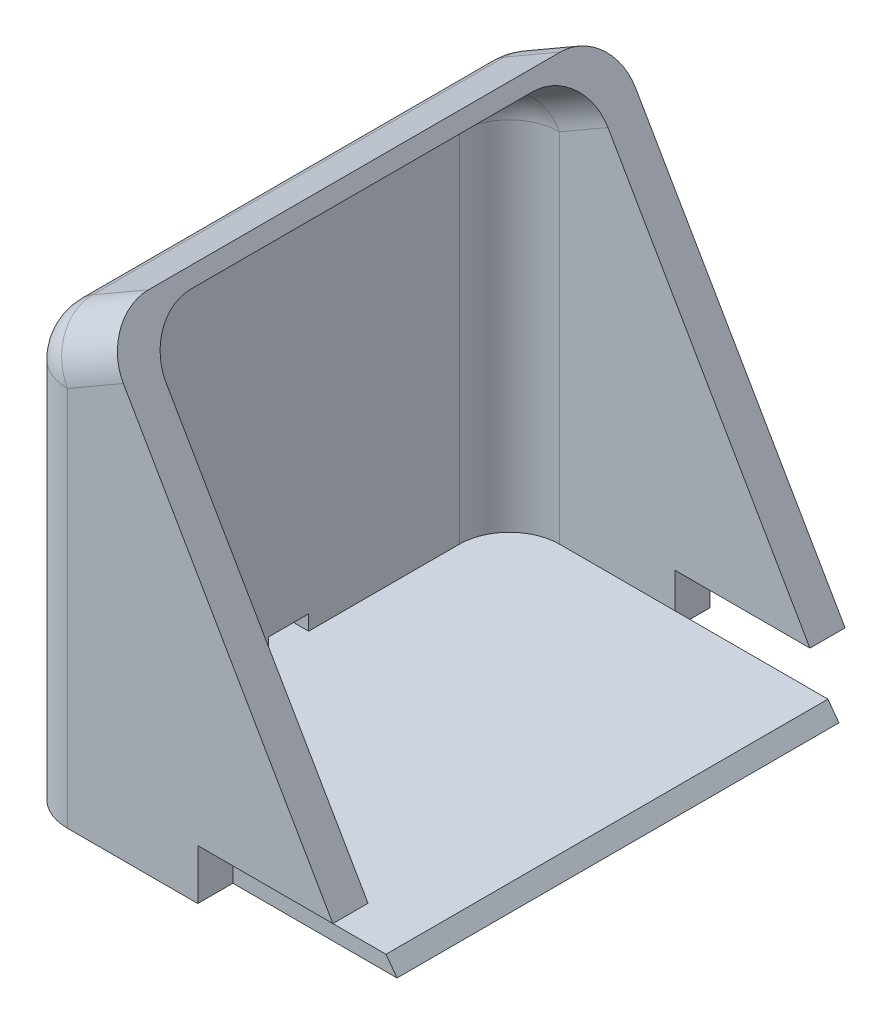
ISO-10303-21;
HEADER;
FILE_DESCRIPTION(('STEP AP214'),'2;1');
FILE_NAME('part.step','',(''),(''),'','','');
FILE_SCHEMA(('AUTOMOTIVE_DESIGN { 1 0 10303 214 1 1 1 1 }'));
ENDSEC;
DATA;
#1=APPLICATION_CONTEXT('core data for automotive mechanical design processes');
#2=APPLICATION_PROTOCOL_DEFINITION('international standard','automotive_design',2000,#1);
#3=PRODUCT_CONTEXT('',#1,'mechanical');
#4=PRODUCT('Part','Part','',(#3));
#5=PRODUCT_RELATED_PRODUCT_CATEGORY('part','',(#4));
#6=PRODUCT_DEFINITION_FORMATION('','',#4);
#7=PRODUCT_DEFINITION_CONTEXT('part definition',#1,'design');
#8=PRODUCT_DEFINITION('design','',#6,#7);
#9=PRODUCT_DEFINITION_SHAPE('','',#8);
#10=(LENGTH_UNIT() NAMED_UNIT(*) SI_UNIT(.MILLI.,.METRE.));
#11=(NAMED_UNIT(*) PLANE_ANGLE_UNIT() SI_UNIT($,.RADIAN.));
#12=(NAMED_UNIT(*) SI_UNIT($,.STERADIAN.) SOLID_ANGLE_UNIT());
#13=UNCERTAINTY_MEASURE_WITH_UNIT(LENGTH_MEASURE(1.E-05),#10,'distance_accuracy_value','');
#14=(GEOMETRIC_REPRESENTATION_CONTEXT(3) GLOBAL_UNCERTAINTY_ASSIGNED_CONTEXT((#13)) GLOBAL_UNIT_ASSIGNED_CONTEXT((#10,
#11,#12)) REPRESENTATION_CONTEXT('',''));
#15=CARTESIAN_POINT('',(0.,0.,0.));
#16=DIRECTION('',(0.,0.,1.));
#17=DIRECTION('',(1.,0.,0.));
#18=AXIS2_PLACEMENT_3D('',#15,#16,#17);
#19=CARTESIAN_POINT('',(-32.9254234033585,0.,89.677493390194));
#20=DIRECTION('',(-1.,0.,0.));
#21=DIRECTION('',(0.,0.,1.));
#22=AXIS2_PLACEMENT_3D('',#19,#20,#21);
#23=PLANE('',#22);
#24=DIRECTION('',(0.,0.,-1.));
#25=VECTOR('',#24,1.);
#26=CARTESIAN_POINT('',(-32.9254234033585,74.1286433605589,0.));
#27=LINE('',#26,#25);
#28=CARTESIAN_POINT('',(-32.9254234033585,74.1286433605589,-78.));
#29=VERTEX_POINT('',#28);
#30=CARTESIAN_POINT('',(-32.9254234033585,74.1286433605589,-10.));
#31=VERTEX_POINT('',#30);
#32=EDGE_CURVE('E69',#29,#31,#27,.F.);
#33=ORIENTED_EDGE('',*,*,#32,.T.);
#34=DIRECTION('',(0.,1.,0.));
#35=VECTOR('',#34,1.);
#36=CARTESIAN_POINT('',(-32.9254234033585,3.,-10.));
#37=LINE('',#36,#35);
#38=CARTESIAN_POINT('',(-32.9254234033585,3.,-9.99999999999999));
#39=VERTEX_POINT('',#38);
#40=EDGE_CURVE('E455',#31,#39,#37,.F.);
#41=ORIENTED_EDGE('',*,*,#40,.T.);
#42=DIRECTION('',(0.,0.,-1.));
#43=VECTOR('',#42,1.);
#44=CARTESIAN_POINT('',(-32.9254234033585,3.,89.677493390194));
#45=LINE('',#44,#43);
#46=CARTESIAN_POINT('',(-32.9254234033585,3.,-40.));
#47=VERTEX_POINT('',#46);
#48=EDGE_CURVE('E535',#39,#47,#45,.T.);
#49=ORIENTED_EDGE('',*,*,#48,.T.);
#50=DIRECTION('',(0.,-1.,0.));
#51=VECTOR('',#50,1.);
#52=CARTESIAN_POINT('',(-32.9254234033585,3.,-40.));
#53=LINE('',#52,#51);
#54=CARTESIAN_POINT('',(-32.9254234033585,6.,-40.));
#55=VERTEX_POINT('',#54);
#56=EDGE_CURVE('E544',#55,#47,#53,.T.);
#57=ORIENTED_EDGE('',*,*,#56,.F.);
#58=DIRECTION('',(0.,0.,1.));
#59=VECTOR('',#58,1.);
#60=CARTESIAN_POINT('',(-32.9254234033585,6.,-48.));
#61=LINE('',#60,#59);
#62=CARTESIAN_POINT('',(-32.9254234033585,6.,-48.));
#63=VERTEX_POINT('',#62);
#64=EDGE_CURVE('E541',#63,#55,#61,.T.);
#65=ORIENTED_EDGE('',*,*,#64,.F.);
#66=DIRECTION('',(0.,1.,0.));
#67=VECTOR('',#66,1.);
#68=CARTESIAN_POINT('',(-32.9254234033585,3.,-48.));
#69=LINE('',#68,#67);
#70=CARTESIAN_POINT('',(-32.9254234033585,3.,-48.));
#71=VERTEX_POINT('',#70);
#72=EDGE_CURVE('E557',#71,#63,#69,.T.);
#73=ORIENTED_EDGE('',*,*,#72,.F.);
#74=CARTESIAN_POINT('',(-32.9254234033585,3.,-78.));
#75=VERTEX_POINT('',#74);
#76=EDGE_CURVE('E539',#71,#75,#45,.T.);
#77=ORIENTED_EDGE('',*,*,#76,.T.);
#78=DIRECTION('',(0.,1.,0.));
#79=VECTOR('',#78,1.);
#80=CARTESIAN_POINT('',(-32.9254234033585,79.9021460524551,-78.));
#81=LINE('',#80,#79);
#82=EDGE_CURVE('E74',#75,#29,#81,.T.);
#83=ORIENTED_EDGE('',*,*,#82,.T.);
#84=EDGE_LOOP('',(#33,#41,#49,#57,#65,#73,#77,#83));
#85=FACE_BOUND('',#84,.T.);
#86=ADVANCED_FACE('F51',(#85),#23,.F.);
#87=CARTESIAN_POINT('',(0.,0.,0.));
#88=DIRECTION('',(0.,0.,1.));
#89=DIRECTION('',(1.,0.,0.));
#90=AXIS2_PLACEMENT_3D('',#87,#88,#89);
#91=PLANE('',#90);
#92=DIRECTION('',(0.,1.,0.));
#93=VECTOR('',#92,1.);
#94=CARTESIAN_POINT('',(-22.9254234033585,79.9021460524551,0.));
#95=LINE('',#94,#93);
#96=CARTESIAN_POINT('',(-22.9254234033585,3.,0.));
#97=VERTEX_POINT('',#96);
#98=CARTESIAN_POINT('',(-22.9254234033585,74.1286433605589,0.));
#99=VERTEX_POINT('',#98);
#100=EDGE_CURVE('E445',#97,#99,#95,.T.);
#101=ORIENTED_EDGE('',*,*,#100,.T.);
#102=DIRECTION('',(0.866025403784439,0.5,0.));
#103=VECTOR('',#102,1.);
#104=CARTESIAN_POINT('',(-13.320381056767,79.6741171449412,0.));
#105=LINE('',#104,#103);
#106=CARTESIAN_POINT('',(-13.320381056767,79.6741171449412,0.));
#107=VERTEX_POINT('',#106);
#108=EDGE_CURVE('E448',#99,#107,#105,.T.);
#109=ORIENTED_EDGE('',*,*,#108,.T.);
#110=DIRECTION('',(0.500000000000004,-0.866025403784436,0.));
#111=VECTOR('',#110,1.);
#112=CARTESIAN_POINT('',(24.5096189432332,14.150635094611,0.));
#113=LINE('',#112,#111);
#114=CARTESIAN_POINT('',(26.9059892324149,10.,0.));
#115=VERTEX_POINT('',#114);
#116=EDGE_CURVE('E323',#107,#115,#113,.T.);
#117=ORIENTED_EDGE('',*,*,#116,.T.);
#118=DIRECTION('',(-1.,0.,0.));
#119=VECTOR('',#118,1.);
#120=CARTESIAN_POINT('',(0.,10.,0.));
#121=LINE('',#120,#119);
#122=CARTESIAN_POINT('',(0.,10.,0.));
#123=VERTEX_POINT('',#122);
#124=EDGE_CURVE('E337',#115,#123,#121,.T.);
#125=ORIENTED_EDGE('',*,*,#124,.T.);
#126=DIRECTION('',(0.,-1.,0.));
#127=VECTOR('',#126,1.);
#128=CARTESIAN_POINT('',(0.,0.,0.));
#129=LINE('',#128,#127);
#130=CARTESIAN_POINT('',(0.,3.,0.));
#131=VERTEX_POINT('',#130);
#132=EDGE_CURVE('E317',#123,#131,#129,.T.);
#133=ORIENTED_EDGE('',*,*,#132,.T.);
#134=DIRECTION('',(1.,0.,0.));
#135=VECTOR('',#134,1.);
#136=CARTESIAN_POINT('',(0.,3.,0.));
#137=LINE('',#136,#135);
#138=EDGE_CURVE('E254',#97,#131,#137,.T.);
#139=ORIENTED_EDGE('',*,*,#138,.F.);
#140=EDGE_LOOP('',(#101,#109,#117,#125,#133,#139));
#141=FACE_BOUND('',#140,.T.);
#142=ADVANCED_FACE('F516',(#141),#91,.F.);
#143=CARTESIAN_POINT('',(0.,3.,-44.));
#144=DIRECTION('',(0.,-1.,0.));
#145=DIRECTION('',(0.,0.,-1.));
#146=AXIS2_PLACEMENT_3D('',#143,#144,#145);
#147=PLANE('',#146);
#148=DIRECTION('',(-1.,0.,0.));
#149=VECTOR('',#148,1.);
#150=CARTESIAN_POINT('',(32.68,3.,0.));
#151=LINE('',#150,#149);
#152=CARTESIAN_POINT('',(30.4885431230028,3.,0.));
#153=VERTEX_POINT('',#152);
#154=EDGE_CURVE('E246',#153,#131,#151,.T.);
#155=ORIENTED_EDGE('',*,*,#154,.F.);
#156=DIRECTION('',(0.,0.,1.));
#157=VECTOR('',#156,1.);
#158=CARTESIAN_POINT('',(30.4885431230028,3.,-95.));
#159=LINE('',#158,#157);
#160=CARTESIAN_POINT('',(30.4885431230028,3.,-88.));
#161=VERTEX_POINT('',#160);
#162=EDGE_CURVE('E230',#161,#153,#159,.T.);
#163=ORIENTED_EDGE('',*,*,#162,.F.);
#164=DIRECTION('',(-1.,0.,0.));
#165=VECTOR('',#164,1.);
#166=CARTESIAN_POINT('',(32.68,3.,-88.));
#167=LINE('',#166,#165);
#168=CARTESIAN_POINT('',(0.,3.,-88.));
#169=VERTEX_POINT('',#168);
#170=EDGE_CURVE('E257',#161,#169,#167,.T.);
#171=ORIENTED_EDGE('',*,*,#170,.T.);
#172=DIRECTION('',(1.,0.,0.));
#173=VECTOR('',#172,1.);
#174=CARTESIAN_POINT('',(0.,3.,-88.));
#175=LINE('',#174,#173);
#176=CARTESIAN_POINT('',(-22.9254234033585,3.,-88.));
#177=VERTEX_POINT('',#176);
#178=EDGE_CURVE('E311',#177,#169,#175,.T.);
#179=ORIENTED_EDGE('',*,*,#178,.F.);
#180=CARTESIAN_POINT('',(-22.9254234033585,3.,-78.));
#181=DIRECTION('',(0.,-1.,0.));
#182=DIRECTION('',(0.,0.,-1.));
#183=AXIS2_PLACEMENT_3D('',#180,#181,#182);
#184=CIRCLE('',#183,10.);
#185=EDGE_CURVE('E458',#177,#75,#184,.F.);
#186=ORIENTED_EDGE('',*,*,#185,.T.);
#187=ORIENTED_EDGE('',*,*,#76,.F.);
#188=DIRECTION('',(-1.,0.,0.));
#189=VECTOR('',#188,1.);
#190=CARTESIAN_POINT('',(-24.3814196580409,3.,-48.));
#191=LINE('',#190,#189);
#192=CARTESIAN_POINT('',(-35.9254234033585,3.,-48.));
#193=VERTEX_POINT('',#192);
#194=EDGE_CURVE('E553',#71,#193,#191,.T.);
#195=ORIENTED_EDGE('',*,*,#194,.T.);
#196=DIRECTION('',(0.,0.,1.));
#197=VECTOR('',#196,1.);
#198=CARTESIAN_POINT('',(-35.9254234033585,3.,-48.));
#199=LINE('',#198,#197);
#200=CARTESIAN_POINT('',(-35.9254234033585,3.,-40.));
#201=VERTEX_POINT('',#200);
#202=EDGE_CURVE('E550',#193,#201,#199,.T.);
#203=ORIENTED_EDGE('',*,*,#202,.T.);
#204=DIRECTION('',(-1.,0.,0.));
#205=VECTOR('',#204,1.);
#206=CARTESIAN_POINT('',(-24.3814196580409,3.,-40.));
#207=LINE('',#206,#205);
#208=EDGE_CURVE('E555',#47,#201,#207,.T.);
#209=ORIENTED_EDGE('',*,*,#208,.F.);
#210=ORIENTED_EDGE('',*,*,#48,.F.);
#211=CARTESIAN_POINT('',(-22.9254234033585,3.,-10.));
#212=DIRECTION('',(0.,-1.,0.));
#213=DIRECTION('',(0.,0.,-1.));
#214=AXIS2_PLACEMENT_3D('',#211,#212,#213);
#215=CIRCLE('',#214,10.);
#216=EDGE_CURVE('E461',#39,#97,#215,.F.);
#217=ORIENTED_EDGE('',*,*,#216,.T.);
#218=ORIENTED_EDGE('',*,*,#138,.T.);
#219=EDGE_LOOP('',(#155,#163,#171,#179,#186,#187,#195,#203,#209,#210,#217,#218));
#220=FACE_BOUND('',#219,.T.);
#221=ADVANCED_FACE('F252',(#220),#147,.F.);
#222=CARTESIAN_POINT('',(0.,0.,-88.));
#223=DIRECTION('',(0.,0.,-1.));
#224=DIRECTION('',(-1.,0.,0.));
#225=AXIS2_PLACEMENT_3D('',#222,#223,#224);
#226=PLANE('',#225);
#227=DIRECTION('',(0.500000000000005,-0.866025403784436,0.));
#228=VECTOR('',#227,1.);
#229=CARTESIAN_POINT('',(24.5096189432332,14.150635094611,-88.));
#230=LINE('',#229,#228);
#231=CARTESIAN_POINT('',(-13.320381056767,79.6741171449412,-88.));
#232=VERTEX_POINT('',#231);
#233=CARTESIAN_POINT('',(26.9059892324149,10.,-88.));
#234=VERTEX_POINT('',#233);
#235=EDGE_CURVE('E283',#232,#234,#230,.T.);
#236=ORIENTED_EDGE('',*,*,#235,.F.);
#237=DIRECTION('',(0.866025403784439,0.5,0.));
#238=VECTOR('',#237,1.);
#239=CARTESIAN_POINT('',(-27.9254234033584,71.2418920146107,-88.));
#240=LINE('',#239,#238);
#241=CARTESIAN_POINT('',(-22.9254234033585,74.1286433605589,-88.));
#242=VERTEX_POINT('',#241);
#243=EDGE_CURVE('E442',#232,#242,#240,.F.);
#244=ORIENTED_EDGE('',*,*,#243,.T.);
#245=DIRECTION('',(0.,1.,0.));
#246=VECTOR('',#245,1.);
#247=CARTESIAN_POINT('',(-22.9254234033585,3.,-88.));
#248=LINE('',#247,#246);
#249=EDGE_CURVE('E439',#242,#177,#248,.F.);
#250=ORIENTED_EDGE('',*,*,#249,.T.);
#251=ORIENTED_EDGE('',*,*,#178,.T.);
#252=DIRECTION('',(0.,-1.,0.));
#253=VECTOR('',#252,1.);
#254=CARTESIAN_POINT('',(0.,0.,-88.));
#255=LINE('',#254,#253);
#256=CARTESIAN_POINT('',(0.,10.,-88.));
#257=VERTEX_POINT('',#256);
#258=EDGE_CURVE('E298',#257,#169,#255,.T.);
#259=ORIENTED_EDGE('',*,*,#258,.F.);
#260=DIRECTION('',(-1.,0.,0.));
#261=VECTOR('',#260,1.);
#262=CARTESIAN_POINT('',(0.,10.,-88.));
#263=LINE('',#262,#261);
#264=EDGE_CURVE('E277',#234,#257,#263,.T.);
#265=ORIENTED_EDGE('',*,*,#264,.F.);
#266=EDGE_LOOP('',(#236,#244,#250,#251,#259,#265));
#267=FACE_BOUND('',#266,.T.);
#268=ADVANCED_FACE('F687',(#267),#226,.F.);
#269=CARTESIAN_POINT('',(0.,0.,7.));
#270=DIRECTION('',(1.,0.,0.));
#271=DIRECTION('',(0.,0.,-1.));
#272=AXIS2_PLACEMENT_3D('',#269,#270,#271);
#273=PLANE('',#272);
#274=DIRECTION('',(0.,0.,-1.));
#275=VECTOR('',#274,1.);
#276=CARTESIAN_POINT('',(0.,0.,7.));
#277=LINE('',#276,#275);
#278=CARTESIAN_POINT('',(0.,0.,7.));
#279=VERTEX_POINT('',#278);
#280=CARTESIAN_POINT('',(0.,0.,0.));
#281=VERTEX_POINT('',#280);
#282=EDGE_CURVE('E354',#279,#281,#277,.T.);
#283=ORIENTED_EDGE('',*,*,#282,.T.);
#284=DIRECTION('',(0.,-1.,0.));
#285=VECTOR('',#284,1.);
#286=CARTESIAN_POINT('',(0.,0.,0.));
#287=LINE('',#286,#285);
#288=EDGE_CURVE('E529',#131,#281,#287,.T.);
#289=ORIENTED_EDGE('',*,*,#288,.F.);
#290=ORIENTED_EDGE('',*,*,#132,.F.);
#291=DIRECTION('',(0.,0.,-1.));
#292=VECTOR('',#291,1.);
#293=CARTESIAN_POINT('',(0.,10.,7.));
#294=LINE('',#293,#292);
#295=CARTESIAN_POINT('',(0.,10.,7.));
#296=VERTEX_POINT('',#295);
#297=EDGE_CURVE('E350',#296,#123,#294,.T.);
#298=ORIENTED_EDGE('',*,*,#297,.F.);
#299=DIRECTION('',(0.,-1.,0.));
#300=VECTOR('',#299,1.);
#301=CARTESIAN_POINT('',(0.,0.,7.));
#302=LINE('',#301,#300);
#303=EDGE_CURVE('E322',#296,#279,#302,.T.);
#304=ORIENTED_EDGE('',*,*,#303,.T.);
#305=EDGE_LOOP('',(#283,#289,#290,#298,#304));
#306=FACE_BOUND('',#305,.T.);
#307=ADVANCED_FACE('F530',(#306),#273,.T.);
#308=ORIENTED_EDGE('',*,*,#258,.T.);
#309=DIRECTION('',(0.,1.,0.));
#310=VECTOR('',#309,1.);
#311=CARTESIAN_POINT('',(0.,0.,-88.));
#312=LINE('',#311,#310);
#313=CARTESIAN_POINT('',(0.,0.,-88.));
#314=VERTEX_POINT('',#313);
#315=EDGE_CURVE('E267',#314,#169,#312,.T.);
#316=ORIENTED_EDGE('',*,*,#315,.F.);
#317=CARTESIAN_POINT('',(0.,0.,-95.));
#318=VERTEX_POINT('',#317);
#319=EDGE_CURVE('E353',#314,#318,#277,.T.);
#320=ORIENTED_EDGE('',*,*,#319,.T.);
#321=DIRECTION('',(0.,-1.,0.));
#322=VECTOR('',#321,1.);
#323=CARTESIAN_POINT('',(0.,0.,-95.));
#324=LINE('',#323,#322);
#325=CARTESIAN_POINT('',(0.,10.,-95.));
#326=VERTEX_POINT('',#325);
#327=EDGE_CURVE('E282',#326,#318,#324,.T.);
#328=ORIENTED_EDGE('',*,*,#327,.F.);
#329=DIRECTION('',(0.,0.,1.));
#330=VECTOR('',#329,1.);
#331=CARTESIAN_POINT('',(0.,10.,-95.));
#332=LINE('',#331,#330);
#333=EDGE_CURVE('E307',#326,#257,#332,.T.);
#334=ORIENTED_EDGE('',*,*,#333,.T.);
#335=EDGE_LOOP('',(#308,#316,#320,#328,#334));
#336=FACE_BOUND('',#335,.T.);
#337=ADVANCED_FACE('F773',(#336),#273,.T.);
#338=CARTESIAN_POINT('',(-44.3300000000003,76.7818122995279,7.));
#339=DIRECTION('',(-0.500000000000004,0.866025403784436,0.));
#340=DIRECTION('',(-0.866025403784436,-0.500000000000004,0.));
#341=AXIS2_PLACEMENT_3D('',#338,#339,#340);
#342=PLANE('',#341);
#343=DIRECTION('',(0.,0.,-1.));
#344=VECTOR('',#343,1.);
#345=CARTESIAN_POINT('',(-30.9254234033585,84.5209482059721,7.));
#346=LINE('',#345,#344);
#347=CARTESIAN_POINT('',(-30.9254234033585,84.5209482059721,-85.));
#348=VERTEX_POINT('',#347);
#349=CARTESIAN_POINT('',(-30.9254234033585,84.5209482059721,-3.));
#350=VERTEX_POINT('',#349);
#351=EDGE_CURVE('E361',#348,#350,#346,.F.);
#352=ORIENTED_EDGE('',*,*,#351,.T.);
#353=DIRECTION('',(0.866025403784436,0.500000000000004,0.));
#354=VECTOR('',#353,1.);
#355=CARTESIAN_POINT('',(-44.3300000000003,76.7818122995279,-3.));
#356=LINE('',#355,#354);
#357=CARTESIAN_POINT('',(-19.820381056767,90.9324473941389,-3.));
#358=VERTEX_POINT('',#357);
#359=EDGE_CURVE('E367',#350,#358,#356,.T.);
#360=ORIENTED_EDGE('',*,*,#359,.T.);
#361=DIRECTION('',(0.,0.,-1.));
#362=VECTOR('',#361,1.);
#363=CARTESIAN_POINT('',(-19.820381056767,90.9324473941389,7.));
#364=LINE('',#363,#362);
#365=CARTESIAN_POINT('',(-19.820381056767,90.9324473941389,-85.));
#366=VERTEX_POINT('',#365);
#367=EDGE_CURVE('E334',#358,#366,#364,.T.);
#368=ORIENTED_EDGE('',*,*,#367,.T.);
#369=DIRECTION('',(0.866025403784436,0.500000000000004,0.));
#370=VECTOR('',#369,1.);
#371=CARTESIAN_POINT('',(-44.3300000000003,76.7818122995279,-85.));
#372=LINE('',#371,#370);
#373=EDGE_CURVE('E364',#366,#348,#372,.F.);
#374=ORIENTED_EDGE('',*,*,#373,.T.);
#375=EDGE_LOOP('',(#352,#360,#368,#374));
#376=FACE_BOUND('',#375,.T.);
#377=ADVANCED_FACE('F703',(#376),#342,.T.);
#378=CARTESIAN_POINT('',(-35.9254234033585,0.,7.));
#379=DIRECTION('',(-1.,0.,0.));
#380=DIRECTION('',(0.,-1.,0.));
#381=AXIS2_PLACEMENT_3D('',#378,#379,#380);
#382=PLANE('',#381);
#383=DIRECTION('',(0.,0.,-1.));
#384=VECTOR('',#383,1.);
#385=CARTESIAN_POINT('',(-35.9254234033585,0.,7.));
#386=LINE('',#385,#384);
#387=CARTESIAN_POINT('',(-35.9254234033585,0.,-3.));
#388=VERTEX_POINT('',#387);
#389=CARTESIAN_POINT('',(-35.9254234033585,0.,-85.));
#390=VERTEX_POINT('',#389);
#391=EDGE_CURVE('E357',#388,#390,#386,.T.);
#392=ORIENTED_EDGE('',*,*,#391,.F.);
#393=DIRECTION('',(0.,1.,0.));
#394=VECTOR('',#393,1.);
#395=CARTESIAN_POINT('',(-35.9254234033585,0.,-3.));
#396=LINE('',#395,#394);
#397=CARTESIAN_POINT('',(-35.9254234033585,75.8606941681277,-3.));
#398=VERTEX_POINT('',#397);
#399=EDGE_CURVE('E389',#388,#398,#396,.T.);
#400=ORIENTED_EDGE('',*,*,#399,.T.);
#401=DIRECTION('',(0.,0.,-1.));
#402=VECTOR('',#401,1.);
#403=CARTESIAN_POINT('',(-35.9254234033585,75.8606941681277,7.));
#404=LINE('',#403,#402);
#405=CARTESIAN_POINT('',(-35.9254234033585,75.8606941681277,-85.));
#406=VERTEX_POINT('',#405);
#407=EDGE_CURVE('E383',#398,#406,#404,.T.);
#408=ORIENTED_EDGE('',*,*,#407,.T.);
#409=DIRECTION('',(0.,1.,0.));
#410=VECTOR('',#409,1.);
#411=CARTESIAN_POINT('',(-35.9254234033585,0.,-85.));
#412=LINE('',#411,#410);
#413=EDGE_CURVE('E386',#406,#390,#412,.F.);
#414=ORIENTED_EDGE('',*,*,#413,.T.);
#415=EDGE_LOOP('',(#392,#400,#408,#414));
#416=FACE_BOUND('',#415,.T.);
#417=DIRECTION('',(0.,1.,0.));
#418=VECTOR('',#417,1.);
#419=CARTESIAN_POINT('',(-35.9254234033585,3.,-40.));
#420=LINE('',#419,#418);
#421=CARTESIAN_POINT('',(-35.9254234033585,6.,-40.));
#422=VERTEX_POINT('',#421);
#423=EDGE_CURVE('E429',#201,#422,#420,.T.);
#424=ORIENTED_EDGE('',*,*,#423,.F.);
#425=ORIENTED_EDGE('',*,*,#202,.F.);
#426=DIRECTION('',(0.,-1.,0.));
#427=VECTOR('',#426,1.);
#428=CARTESIAN_POINT('',(-35.9254234033585,3.,-48.));
#429=LINE('',#428,#427);
#430=CARTESIAN_POINT('',(-35.9254234033585,6.,-48.));
#431=VERTEX_POINT('',#430);
#432=EDGE_CURVE('E561',#431,#193,#429,.T.);
#433=ORIENTED_EDGE('',*,*,#432,.F.);
#434=DIRECTION('',(0.,0.,-1.));
#435=VECTOR('',#434,1.);
#436=CARTESIAN_POINT('',(-35.9254234033585,6.,-48.));
#437=LINE('',#436,#435);
#438=EDGE_CURVE('E565',#422,#431,#437,.T.);
#439=ORIENTED_EDGE('',*,*,#438,.F.);
#440=EDGE_LOOP('',(#424,#425,#433,#439));
#441=FACE_BOUND('',#440,.T.);
#442=ADVANCED_FACE('F726',(#416,#441),#382,.T.);
#443=CARTESIAN_POINT('',(0.,0.,7.));
#444=DIRECTION('',(0.,-1.,0.));
#445=DIRECTION('',(1.,0.,0.));
#446=AXIS2_PLACEMENT_3D('',#443,#444,#445);
#447=PLANE('',#446);
#448=DIRECTION('',(-1.,0.,0.));
#449=VECTOR('',#448,1.);
#450=CARTESIAN_POINT('',(0.,0.,7.));
#451=LINE('',#450,#449);
#452=CARTESIAN_POINT('',(-25.9254234033584,0.,7.));
#453=VERTEX_POINT('',#452);
#454=EDGE_CURVE('E318',#279,#453,#451,.T.);
#455=ORIENTED_EDGE('',*,*,#454,.T.);
#456=CARTESIAN_POINT('',(-25.9254234033584,0.,-3.));
#457=DIRECTION('',(0.,-1.,0.));
#458=DIRECTION('',(1.,0.,0.));
#459=AXIS2_PLACEMENT_3D('',#456,#457,#458);
#460=CIRCLE('',#459,10.);
#461=EDGE_CURVE('E395',#453,#388,#460,.T.);
#462=ORIENTED_EDGE('',*,*,#461,.T.);
#463=ORIENTED_EDGE('',*,*,#391,.T.);
#464=CARTESIAN_POINT('',(-25.9254234033584,0.,-85.));
#465=DIRECTION('',(0.,-1.,0.));
#466=DIRECTION('',(1.,0.,0.));
#467=AXIS2_PLACEMENT_3D('',#464,#465,#466);
#468=CIRCLE('',#467,10.);
#469=CARTESIAN_POINT('',(-25.9254234033584,0.,-95.));
#470=VERTEX_POINT('',#469);
#471=EDGE_CURVE('E392',#390,#470,#468,.T.);
#472=ORIENTED_EDGE('',*,*,#471,.T.);
#473=DIRECTION('',(-1.,0.,0.));
#474=VECTOR('',#473,1.);
#475=CARTESIAN_POINT('',(0.,0.,-95.));
#476=LINE('',#475,#474);
#477=EDGE_CURVE('E287',#318,#470,#476,.T.);
#478=ORIENTED_EDGE('',*,*,#477,.F.);
#479=ORIENTED_EDGE('',*,*,#319,.F.);
#480=DIRECTION('',(-1.,0.,0.));
#481=VECTOR('',#480,1.);
#482=CARTESIAN_POINT('',(32.68,0.,-88.));
#483=LINE('',#482,#481);
#484=CARTESIAN_POINT('',(32.68,0.,-88.));
#485=VERTEX_POINT('',#484);
#486=EDGE_CURVE('E264',#485,#314,#483,.T.);
#487=ORIENTED_EDGE('',*,*,#486,.F.);
#488=DIRECTION('',(0.,0.,-1.));
#489=VECTOR('',#488,1.);
#490=CARTESIAN_POINT('',(32.68,0.,0.));
#491=LINE('',#490,#489);
#492=CARTESIAN_POINT('',(32.68,0.,0.));
#493=VERTEX_POINT('',#492);
#494=EDGE_CURVE('E258',#493,#485,#491,.T.);
#495=ORIENTED_EDGE('',*,*,#494,.F.);
#496=DIRECTION('',(-1.,0.,0.));
#497=VECTOR('',#496,1.);
#498=CARTESIAN_POINT('',(32.68,0.,0.));
#499=LINE('',#498,#497);
#500=EDGE_CURVE('E249',#493,#281,#499,.T.);
#501=ORIENTED_EDGE('',*,*,#500,.T.);
#502=ORIENTED_EDGE('',*,*,#282,.F.);
#503=EDGE_LOOP('',(#455,#462,#463,#472,#478,#479,#487,#495,#501,#502));
#504=FACE_BOUND('',#503,.T.);
#505=ADVANCED_FACE('F584',(#504),#447,.T.);
#506=CARTESIAN_POINT('',(0.,10.,7.));
#507=DIRECTION('',(0.,-1.,0.));
#508=DIRECTION('',(1.,0.,0.));
#509=AXIS2_PLACEMENT_3D('',#506,#507,#508);
#510=PLANE('',#509);
#511=ORIENTED_EDGE('',*,*,#124,.F.);
#512=DIRECTION('',(0.,0.,-1.));
#513=VECTOR('',#512,1.);
#514=CARTESIAN_POINT('',(26.9059892324149,10.,7.));
#515=LINE('',#514,#513);
#516=CARTESIAN_POINT('',(26.9059892324149,10.,7.));
#517=VERTEX_POINT('',#516);
#518=EDGE_CURVE('E346',#517,#115,#515,.T.);
#519=ORIENTED_EDGE('',*,*,#518,.F.);
#520=DIRECTION('',(-1.,0.,0.));
#521=VECTOR('',#520,1.);
#522=CARTESIAN_POINT('',(0.,10.,7.));
#523=LINE('',#522,#521);
#524=EDGE_CURVE('E327',#517,#296,#523,.T.);
#525=ORIENTED_EDGE('',*,*,#524,.T.);
#526=ORIENTED_EDGE('',*,*,#297,.T.);
#527=EDGE_LOOP('',(#511,#519,#525,#526));
#528=FACE_BOUND('',#527,.T.);
#529=ADVANCED_FACE('F525',(#528),#510,.T.);
#530=CARTESIAN_POINT('',(24.5096189432332,14.150635094611,7.));
#531=DIRECTION('',(0.866025403784436,0.500000000000004,0.));
#532=DIRECTION('',(-0.500000000000005,0.866025403784436,0.));
#533=AXIS2_PLACEMENT_3D('',#530,#531,#532);
#534=PLANE('',#533);
#535=ORIENTED_EDGE('',*,*,#367,.F.);
#536=CARTESIAN_POINT('',(-14.820381056767,82.2721933562946,-3.));
#537=DIRECTION('',(0.866025403784436,0.500000000000004,0.));
#538=DIRECTION('',(-0.500000000000005,0.866025403784436,0.));
#539=AXIS2_PLACEMENT_3D('',#536,#537,#538);
#540=CIRCLE('',#539,10.);
#541=CARTESIAN_POINT('',(-14.820381056767,82.2721933562946,7.));
#542=VERTEX_POINT('',#541);
#543=EDGE_CURVE('E374',#358,#542,#540,.T.);
#544=ORIENTED_EDGE('',*,*,#543,.T.);
#545=DIRECTION('',(0.500000000000004,-0.866025403784436,0.));
#546=VECTOR('',#545,1.);
#547=CARTESIAN_POINT('',(24.5096189432332,14.150635094611,7.));
#548=LINE('',#547,#546);
#549=EDGE_CURVE('E331',#542,#517,#548,.T.);
#550=ORIENTED_EDGE('',*,*,#549,.T.);
#551=ORIENTED_EDGE('',*,*,#518,.T.);
#552=ORIENTED_EDGE('',*,*,#116,.F.);
#553=CARTESIAN_POINT('',(-13.320381056767,79.6741171449412,-10.));
#554=DIRECTION('',(0.866025403784436,0.500000000000004,0.));
#555=DIRECTION('',(-0.500000000000005,0.866025403784436,0.));
#556=AXIS2_PLACEMENT_3D('',#553,#554,#555);
#557=CIRCLE('',#556,10.);
#558=CARTESIAN_POINT('',(-18.320381056767,88.3343711827856,-9.99999999999999));
#559=VERTEX_POINT('',#558);
#560=EDGE_CURVE('E11',#107,#559,#557,.F.);
#561=ORIENTED_EDGE('',*,*,#560,.T.);
#562=DIRECTION('',(0.,0.,-1.));
#563=VECTOR('',#562,1.);
#564=CARTESIAN_POINT('',(-18.320381056767,88.3343711827856,89.677493390194));
#565=LINE('',#564,#563);
#566=CARTESIAN_POINT('',(-18.320381056767,88.3343711827856,-78.));
#567=VERTEX_POINT('',#566);
#568=EDGE_CURVE('E509',#559,#567,#565,.T.);
#569=ORIENTED_EDGE('',*,*,#568,.T.);
#570=CARTESIAN_POINT('',(-13.320381056767,79.6741171449412,-78.));
#571=DIRECTION('',(0.866025403784436,0.500000000000004,0.));
#572=DIRECTION('',(-0.500000000000005,0.866025403784436,0.));
#573=AXIS2_PLACEMENT_3D('',#570,#571,#572);
#574=CIRCLE('',#573,10.);
#575=EDGE_CURVE('E61',#567,#232,#574,.F.);
#576=ORIENTED_EDGE('',*,*,#575,.T.);
#577=ORIENTED_EDGE('',*,*,#235,.T.);
#578=DIRECTION('',(0.,0.,1.));
#579=VECTOR('',#578,1.);
#580=CARTESIAN_POINT('',(26.9059892324149,10.,-95.));
#581=LINE('',#580,#579);
#582=CARTESIAN_POINT('',(26.9059892324149,10.,-95.));
#583=VERTEX_POINT('',#582);
#584=EDGE_CURVE('E294',#583,#234,#581,.T.);
#585=ORIENTED_EDGE('',*,*,#584,.F.);
#586=DIRECTION('',(0.500000000000005,-0.866025403784436,0.));
#587=VECTOR('',#586,1.);
#588=CARTESIAN_POINT('',(24.5096189432332,14.150635094611,-95.));
#589=LINE('',#588,#587);
#590=CARTESIAN_POINT('',(-14.820381056767,82.2721933562946,-95.));
#591=VERTEX_POINT('',#590);
#592=EDGE_CURVE('E291',#591,#583,#589,.T.);
#593=ORIENTED_EDGE('',*,*,#592,.F.);
#594=CARTESIAN_POINT('',(-14.820381056767,82.2721933562946,-85.));
#595=DIRECTION('',(0.866025403784436,0.500000000000004,0.));
#596=DIRECTION('',(-0.500000000000005,0.866025403784436,0.));
#597=AXIS2_PLACEMENT_3D('',#594,#595,#596);
#598=CIRCLE('',#597,10.);
#599=EDGE_CURVE('E371',#591,#366,#598,.T.);
#600=ORIENTED_EDGE('',*,*,#599,.T.);
#601=EDGE_LOOP('',(#535,#544,#550,#551,#552,#561,#569,#576,#577,#585,#593,#600));
#602=FACE_BOUND('',#601,.T.);
#603=ADVANCED_FACE('F519',(#602),#534,.T.);
#604=CARTESIAN_POINT('',(0.,0.,7.));
#605=DIRECTION('',(0.,0.,1.));
#606=DIRECTION('',(1.,0.,0.));
#607=AXIS2_PLACEMENT_3D('',#604,#605,#606);
#608=PLANE('',#607);
#609=ORIENTED_EDGE('',*,*,#549,.F.);
#610=DIRECTION('',(0.866025403784436,0.500000000000004,0.));
#611=VECTOR('',#610,1.);
#612=CARTESIAN_POINT('',(-39.3300000000002,68.1215582616836,7.));
#613=LINE('',#612,#611);
#614=CARTESIAN_POINT('',(-25.9254234033585,75.8606941681278,7.));
#615=VERTEX_POINT('',#614);
#616=EDGE_CURVE('E380',#542,#615,#613,.F.);
#617=ORIENTED_EDGE('',*,*,#616,.T.);
#618=DIRECTION('',(0.,1.,0.));
#619=VECTOR('',#618,1.);
#620=CARTESIAN_POINT('',(-25.9254234033584,0.,7.));
#621=LINE('',#620,#619);
#622=EDGE_CURVE('E377',#615,#453,#621,.F.);
#623=ORIENTED_EDGE('',*,*,#622,.T.);
#624=ORIENTED_EDGE('',*,*,#454,.F.);
#625=ORIENTED_EDGE('',*,*,#303,.F.);
#626=ORIENTED_EDGE('',*,*,#524,.F.);
#627=EDGE_LOOP('',(#609,#617,#623,#624,#625,#626));
#628=FACE_BOUND('',#627,.T.);
#629=ADVANCED_FACE('F710',(#628),#608,.T.);
#630=CARTESIAN_POINT('',(0.,10.,-95.));
#631=DIRECTION('',(0.,1.,0.));
#632=DIRECTION('',(-1.,0.,0.));
#633=AXIS2_PLACEMENT_3D('',#630,#631,#632);
#634=PLANE('',#633);
#635=ORIENTED_EDGE('',*,*,#264,.T.);
#636=ORIENTED_EDGE('',*,*,#333,.F.);
#637=DIRECTION('',(-1.,0.,0.));
#638=VECTOR('',#637,1.);
#639=CARTESIAN_POINT('',(0.,10.,-95.));
#640=LINE('',#639,#638);
#641=EDGE_CURVE('E278',#583,#326,#640,.T.);
#642=ORIENTED_EDGE('',*,*,#641,.F.);
#643=ORIENTED_EDGE('',*,*,#584,.T.);
#644=EDGE_LOOP('',(#635,#636,#642,#643));
#645=FACE_BOUND('',#644,.T.);
#646=ADVANCED_FACE('F690',(#645),#634,.F.);
#647=CARTESIAN_POINT('',(0.,0.,-95.));
#648=DIRECTION('',(0.,0.,-1.));
#649=DIRECTION('',(-1.,0.,0.));
#650=AXIS2_PLACEMENT_3D('',#647,#648,#649);
#651=PLANE('',#650);
#652=ORIENTED_EDGE('',*,*,#477,.T.);
#653=DIRECTION('',(0.,1.,0.));
#654=VECTOR('',#653,1.);
#655=CARTESIAN_POINT('',(-25.9254234033584,0.,-95.));
#656=LINE('',#655,#654);
#657=CARTESIAN_POINT('',(-25.9254234033585,75.8606941681278,-95.));
#658=VERTEX_POINT('',#657);
#659=EDGE_CURVE('E401',#470,#658,#656,.T.);
#660=ORIENTED_EDGE('',*,*,#659,.T.);
#661=DIRECTION('',(0.866025403784436,0.500000000000004,0.));
#662=VECTOR('',#661,1.);
#663=CARTESIAN_POINT('',(-39.3300000000002,68.1215582616836,-95.));
#664=LINE('',#663,#662);
#665=EDGE_CURVE('E398',#658,#591,#664,.T.);
#666=ORIENTED_EDGE('',*,*,#665,.T.);
#667=ORIENTED_EDGE('',*,*,#592,.T.);
#668=ORIENTED_EDGE('',*,*,#641,.T.);
#669=ORIENTED_EDGE('',*,*,#327,.T.);
#670=EDGE_LOOP('',(#652,#660,#666,#667,#668,#669));
#671=FACE_BOUND('',#670,.T.);
#672=ADVANCED_FACE('F756',(#671),#651,.T.);
#673=CARTESIAN_POINT('',(32.68,0.,0.));
#674=DIRECTION('',(0.,0.,-1.));
#675=DIRECTION('',(-1.,0.,0.));
#676=AXIS2_PLACEMENT_3D('',#673,#674,#675);
#677=PLANE('',#676);
#678=ORIENTED_EDGE('',*,*,#500,.F.);
#679=DIRECTION('',(0.589867291351998,-0.807500203463167,0.));
#680=VECTOR('',#679,1.);
#681=CARTESIAN_POINT('',(32.68,0.,0.));
#682=LINE('',#681,#680);
#683=EDGE_CURVE('E233',#153,#493,#682,.T.);
#684=ORIENTED_EDGE('',*,*,#683,.F.);
#685=ORIENTED_EDGE('',*,*,#154,.T.);
#686=ORIENTED_EDGE('',*,*,#288,.T.);
#687=EDGE_LOOP('',(#678,#684,#685,#686));
#688=FACE_BOUND('',#687,.T.);
#689=ADVANCED_FACE('F244',(#688),#677,.F.);
#690=CARTESIAN_POINT('',(32.68,0.,-88.));
#691=DIRECTION('',(0.,0.,1.));
#692=DIRECTION('',(1.,0.,0.));
#693=AXIS2_PLACEMENT_3D('',#690,#691,#692);
#694=PLANE('',#693);
#695=ORIENTED_EDGE('',*,*,#170,.F.);
#696=DIRECTION('',(0.589867291351998,-0.807500203463167,0.));
#697=VECTOR('',#696,1.);
#698=CARTESIAN_POINT('',(32.68,0.,-88.));
#699=LINE('',#698,#697);
#700=EDGE_CURVE('E236',#161,#485,#699,.T.);
#701=ORIENTED_EDGE('',*,*,#700,.T.);
#702=ORIENTED_EDGE('',*,*,#486,.T.);
#703=ORIENTED_EDGE('',*,*,#315,.T.);
#704=EDGE_LOOP('',(#695,#701,#702,#703));
#705=FACE_BOUND('',#704,.T.);
#706=ADVANCED_FACE('F581',(#705),#694,.F.);
#707=CARTESIAN_POINT('',(-42.8299999999999,74.1837360881749,89.677493390194));
#708=DIRECTION('',(-0.5,0.866025403784439,0.));
#709=DIRECTION('',(-0.866025403784439,-0.5,0.));
#710=AXIS2_PLACEMENT_3D('',#707,#708,#709);
#711=PLANE('',#710);
#712=DIRECTION('',(0.,0.,-1.));
#713=VECTOR('',#712,1.);
#714=CARTESIAN_POINT('',(-27.9254234033585,82.7888973984033,-88.));
#715=LINE('',#714,#713);
#716=CARTESIAN_POINT('',(-27.9254234033585,82.7888973984033,-10.));
#717=VERTEX_POINT('',#716);
#718=CARTESIAN_POINT('',(-27.9254234033585,82.7888973984033,-78.));
#719=VERTEX_POINT('',#718);
#720=EDGE_CURVE('E404',#717,#719,#715,.T.);
#721=ORIENTED_EDGE('',*,*,#720,.T.);
#722=DIRECTION('',(0.866025403784439,0.5,0.));
#723=VECTOR('',#722,1.);
#724=CARTESIAN_POINT('',(-18.320381056767,88.3343711827856,-78.));
#725=LINE('',#724,#723);
#726=EDGE_CURVE('E435',#719,#567,#725,.T.);
#727=ORIENTED_EDGE('',*,*,#726,.T.);
#728=ORIENTED_EDGE('',*,*,#568,.F.);
#729=DIRECTION('',(0.866025403784439,0.5,0.));
#730=VECTOR('',#729,1.);
#731=CARTESIAN_POINT('',(-32.9254234033585,79.9021460524551,-10.));
#732=LINE('',#731,#730);
#733=EDGE_CURVE('E432',#559,#717,#732,.F.);
#734=ORIENTED_EDGE('',*,*,#733,.T.);
#735=EDGE_LOOP('',(#721,#727,#728,#734));
#736=FACE_BOUND('',#735,.T.);
#737=ADVANCED_FACE('F504',(#736),#711,.F.);
#738=CARTESIAN_POINT('',(-24.3814196580409,3.,-40.));
#739=DIRECTION('',(0.,0.,1.));
#740=DIRECTION('',(1.,0.,0.));
#741=AXIS2_PLACEMENT_3D('',#738,#739,#740);
#742=PLANE('',#741);
#743=ORIENTED_EDGE('',*,*,#56,.T.);
#744=ORIENTED_EDGE('',*,*,#208,.T.);
#745=ORIENTED_EDGE('',*,*,#423,.T.);
#746=DIRECTION('',(-1.,0.,0.));
#747=VECTOR('',#746,1.);
#748=CARTESIAN_POINT('',(-24.3814196580409,6.,-40.));
#749=LINE('',#748,#747);
#750=EDGE_CURVE('E545',#55,#422,#749,.T.);
#751=ORIENTED_EDGE('',*,*,#750,.F.);
#752=EDGE_LOOP('',(#743,#744,#745,#751));
#753=FACE_BOUND('',#752,.T.);
#754=ADVANCED_FACE('F791',(#753),#742,.F.);
#755=CARTESIAN_POINT('',(-24.3814196580409,3.,-48.));
#756=DIRECTION('',(0.,0.,-1.));
#757=DIRECTION('',(-1.,0.,0.));
#758=AXIS2_PLACEMENT_3D('',#755,#756,#757);
#759=PLANE('',#758);
#760=ORIENTED_EDGE('',*,*,#72,.T.);
#761=DIRECTION('',(-1.,0.,0.));
#762=VECTOR('',#761,1.);
#763=CARTESIAN_POINT('',(-24.3814196580409,6.,-48.));
#764=LINE('',#763,#762);
#765=EDGE_CURVE('E549',#63,#431,#764,.T.);
#766=ORIENTED_EDGE('',*,*,#765,.T.);
#767=ORIENTED_EDGE('',*,*,#432,.T.);
#768=ORIENTED_EDGE('',*,*,#194,.F.);
#769=EDGE_LOOP('',(#760,#766,#767,#768));
#770=FACE_BOUND('',#769,.T.);
#771=ADVANCED_FACE('F799',(#770),#759,.F.);
#772=CARTESIAN_POINT('',(-24.3814196580409,6.,-48.));
#773=DIRECTION('',(0.,1.,0.));
#774=DIRECTION('',(-1.,0.,0.));
#775=AXIS2_PLACEMENT_3D('',#772,#773,#774);
#776=PLANE('',#775);
#777=ORIENTED_EDGE('',*,*,#64,.T.);
#778=ORIENTED_EDGE('',*,*,#750,.T.);
#779=ORIENTED_EDGE('',*,*,#438,.T.);
#780=ORIENTED_EDGE('',*,*,#765,.F.);
#781=EDGE_LOOP('',(#777,#778,#779,#780));
#782=FACE_BOUND('',#781,.T.);
#783=ADVANCED_FACE('F795',(#782),#776,.F.);
#784=CARTESIAN_POINT('',(-25.9254234033584,0.,-85.));
#785=DIRECTION('',(0.,1.,0.));
#786=DIRECTION('',(-1.,0.,0.));
#787=AXIS2_PLACEMENT_3D('',#784,#785,#786);
#788=CYLINDRICAL_SURFACE('',#787,10.);
#789=ORIENTED_EDGE('',*,*,#471,.F.);
#790=ORIENTED_EDGE('',*,*,#413,.F.);
#791=CARTESIAN_POINT('',(-25.9254234033585,75.8606941681278,-85.));
#792=DIRECTION('',(0.,1.,0.));
#793=DIRECTION('',(-1.,0.,0.));
#794=AXIS2_PLACEMENT_3D('',#791,#792,#793);
#795=CIRCLE('',#794,10.);
#796=EDGE_CURVE('E425',#658,#406,#795,.T.);
#797=ORIENTED_EDGE('',*,*,#796,.F.);
#798=ORIENTED_EDGE('',*,*,#659,.F.);
#799=EDGE_LOOP('',(#789,#790,#797,#798));
#800=FACE_BOUND('',#799,.T.);
#801=ADVANCED_FACE('F731',(#800),#788,.T.);
#802=CARTESIAN_POINT('',(-39.3300000000002,68.1215582616836,-85.));
#803=DIRECTION('',(0.866025403784436,0.500000000000004,0.));
#804=DIRECTION('',(-0.500000000000004,0.866025403784436,0.));
#805=AXIS2_PLACEMENT_3D('',#802,#803,#804);
#806=CYLINDRICAL_SURFACE('',#805,10.);
#807=ORIENTED_EDGE('',*,*,#599,.F.);
#808=ORIENTED_EDGE('',*,*,#665,.F.);
#809=CARTESIAN_POINT('',(-25.9254234033585,75.8606941681278,-85.));
#810=DIRECTION('',(-0.866025403784436,-0.500000000000004,0.));
#811=DIRECTION('',(0.500000000000005,-0.866025403784436,0.));
#812=AXIS2_PLACEMENT_3D('',#809,#810,#811);
#813=CIRCLE('',#812,10.);
#814=EDGE_CURVE('E421',#348,#658,#813,.T.);
#815=ORIENTED_EDGE('',*,*,#814,.F.);
#816=ORIENTED_EDGE('',*,*,#373,.F.);
#817=EDGE_LOOP('',(#807,#808,#815,#816));
#818=FACE_BOUND('',#817,.T.);
#819=ADVANCED_FACE('F698',(#818),#806,.T.);
#820=CARTESIAN_POINT('',(-25.9254234033585,75.8606941681278,-85.));
#821=DIRECTION('',(0.,0.,-1.));
#822=DIRECTION('',(-1.,0.,0.));
#823=AXIS2_PLACEMENT_3D('',#820,#821,#822);
#824=SPHERICAL_SURFACE('',#823,10.);
#825=ORIENTED_EDGE('',*,*,#814,.T.);
#826=ORIENTED_EDGE('',*,*,#796,.T.);
#827=CARTESIAN_POINT('',(-25.9254234033585,75.8606941681277,-85.));
#828=DIRECTION('',(0.,0.,-1.));
#829=DIRECTION('',(-1.,0.,0.));
#830=AXIS2_PLACEMENT_3D('',#827,#828,#829);
#831=CIRCLE('',#830,10.);
#832=EDGE_CURVE('E417',#348,#406,#831,.F.);
#833=ORIENTED_EDGE('',*,*,#832,.F.);
#834=EDGE_LOOP('',(#825,#826,#833));
#835=FACE_BOUND('',#834,.T.);
#836=ADVANCED_FACE('F734',(#835),#824,.T.);
#837=CARTESIAN_POINT('',(-25.9254234033584,0.,-3.));
#838=DIRECTION('',(0.,1.,0.));
#839=DIRECTION('',(-1.,0.,0.));
#840=AXIS2_PLACEMENT_3D('',#837,#838,#839);
#841=CYLINDRICAL_SURFACE('',#840,10.);
#842=ORIENTED_EDGE('',*,*,#461,.F.);
#843=ORIENTED_EDGE('',*,*,#622,.F.);
#844=CARTESIAN_POINT('',(-25.9254234033585,75.8606941681277,-3.));
#845=DIRECTION('',(0.,1.,0.));
#846=DIRECTION('',(0.,0.,1.));
#847=AXIS2_PLACEMENT_3D('',#844,#845,#846);
#848=CIRCLE('',#847,10.);
#849=EDGE_CURVE('E413',#398,#615,#848,.T.);
#850=ORIENTED_EDGE('',*,*,#849,.F.);
#851=ORIENTED_EDGE('',*,*,#399,.F.);
#852=EDGE_LOOP('',(#842,#843,#850,#851));
#853=FACE_BOUND('',#852,.T.);
#854=ADVANCED_FACE('F721',(#853),#841,.T.);
#855=CARTESIAN_POINT('',(-25.9254234033585,75.8606941681277,7.));
#856=DIRECTION('',(0.,0.,-1.));
#857=DIRECTION('',(-1.,0.,0.));
#858=AXIS2_PLACEMENT_3D('',#855,#856,#857);
#859=CYLINDRICAL_SURFACE('',#858,10.);
#860=ORIENTED_EDGE('',*,*,#832,.T.);
#861=ORIENTED_EDGE('',*,*,#407,.F.);
#862=CARTESIAN_POINT('',(-25.9254234033585,75.8606941681278,-3.));
#863=DIRECTION('',(0.,0.,1.));
#864=DIRECTION('',(1.,0.,0.));
#865=AXIS2_PLACEMENT_3D('',#862,#863,#864);
#866=CIRCLE('',#865,10.);
#867=EDGE_CURVE('E409',#350,#398,#866,.T.);
#868=ORIENTED_EDGE('',*,*,#867,.F.);
#869=ORIENTED_EDGE('',*,*,#351,.F.);
#870=EDGE_LOOP('',(#860,#861,#868,#869));
#871=FACE_BOUND('',#870,.T.);
#872=ADVANCED_FACE('F736',(#871),#859,.T.);
#873=CARTESIAN_POINT('',(-25.9254234033585,75.8606941681278,-3.));
#874=DIRECTION('',(0.,0.,1.));
#875=DIRECTION('',(1.,0.,0.));
#876=AXIS2_PLACEMENT_3D('',#873,#874,#875);
#877=SPHERICAL_SURFACE('',#876,10.);
#878=ORIENTED_EDGE('',*,*,#867,.T.);
#879=ORIENTED_EDGE('',*,*,#849,.T.);
#880=CARTESIAN_POINT('',(-25.9254234033585,75.8606941681278,-3.));
#881=DIRECTION('',(-0.866025403784436,-0.500000000000004,0.));
#882=DIRECTION('',(0.500000000000004,-0.866025403784436,0.));
#883=AXIS2_PLACEMENT_3D('',#880,#881,#882);
#884=CIRCLE('',#883,10.);
#885=EDGE_CURVE('E405',#350,#615,#884,.F.);
#886=ORIENTED_EDGE('',*,*,#885,.F.);
#887=EDGE_LOOP('',(#878,#879,#886));
#888=FACE_BOUND('',#887,.T.);
#889=ADVANCED_FACE('F716',(#888),#877,.T.);
#890=CARTESIAN_POINT('',(-39.3300000000002,68.1215582616836,-3.));
#891=DIRECTION('',(0.866025403784436,0.500000000000004,0.));
#892=DIRECTION('',(-0.500000000000004,0.866025403784436,0.));
#893=AXIS2_PLACEMENT_3D('',#890,#891,#892);
#894=CYLINDRICAL_SURFACE('',#893,10.);
#895=ORIENTED_EDGE('',*,*,#885,.T.);
#896=ORIENTED_EDGE('',*,*,#616,.F.);
#897=ORIENTED_EDGE('',*,*,#543,.F.);
#898=ORIENTED_EDGE('',*,*,#359,.F.);
#899=EDGE_LOOP('',(#895,#896,#897,#898));
#900=FACE_BOUND('',#899,.T.);
#901=ADVANCED_FACE('F713',(#900),#894,.T.);
#902=CARTESIAN_POINT('',(-22.9254234033585,0.,-10.));
#903=DIRECTION('',(0.,-1.,0.));
#904=DIRECTION('',(0.,0.,-1.));
#905=AXIS2_PLACEMENT_3D('',#902,#903,#904);
#906=CYLINDRICAL_SURFACE('',#905,10.);
#907=ORIENTED_EDGE('',*,*,#216,.F.);
#908=ORIENTED_EDGE('',*,*,#40,.F.);
#909=CARTESIAN_POINT('',(-22.9254234033585,74.1286433605589,-10.));
#910=DIRECTION('',(0.,-1.,0.));
#911=DIRECTION('',(1.,0.,0.));
#912=AXIS2_PLACEMENT_3D('',#909,#910,#911);
#913=CIRCLE('',#912,10.);
#914=EDGE_CURVE('E55',#99,#31,#913,.T.);
#915=ORIENTED_EDGE('',*,*,#914,.F.);
#916=ORIENTED_EDGE('',*,*,#100,.F.);
#917=EDGE_LOOP('',(#907,#908,#915,#916));
#918=FACE_BOUND('',#917,.T.);
#919=ADVANCED_FACE('F53',(#918),#906,.F.);
#920=CARTESIAN_POINT('',(-37.8299999999999,65.5234820503305,-10.));
#921=DIRECTION('',(-0.866025403784439,-0.5,0.));
#922=DIRECTION('',(0.5,-0.866025403784439,0.));
#923=AXIS2_PLACEMENT_3D('',#920,#921,#922);
#924=CYLINDRICAL_SURFACE('',#923,10.);
#925=ORIENTED_EDGE('',*,*,#560,.F.);
#926=ORIENTED_EDGE('',*,*,#108,.F.);
#927=CARTESIAN_POINT('',(-22.9254234033585,74.1286433605589,-10.));
#928=DIRECTION('',(0.866025403784439,0.5,0.));
#929=DIRECTION('',(-0.5,0.866025403784439,0.));
#930=AXIS2_PLACEMENT_3D('',#927,#928,#929);
#931=CIRCLE('',#930,10.);
#932=EDGE_CURVE('E481',#717,#99,#931,.T.);
#933=ORIENTED_EDGE('',*,*,#932,.F.);
#934=ORIENTED_EDGE('',*,*,#733,.F.);
#935=EDGE_LOOP('',(#925,#926,#933,#934));
#936=FACE_BOUND('',#935,.T.);
#937=ADVANCED_FACE('F513',(#936),#924,.F.);
#938=CARTESIAN_POINT('',(-22.9254234033584,74.1286433605589,-10.));
#939=DIRECTION('',(0.,0.,1.));
#940=DIRECTION('',(0.,-1.,0.));
#941=AXIS2_PLACEMENT_3D('',#938,#939,#940);
#942=SPHERICAL_SURFACE('',#941,10.);
#943=ORIENTED_EDGE('',*,*,#932,.T.);
#944=ORIENTED_EDGE('',*,*,#914,.T.);
#945=CARTESIAN_POINT('',(-22.9254234033585,74.1286433605589,-10.));
#946=DIRECTION('',(0.,0.,-1.));
#947=DIRECTION('',(-1.,0.,0.));
#948=AXIS2_PLACEMENT_3D('',#945,#946,#947);
#949=CIRCLE('',#948,10.);
#950=EDGE_CURVE('E478',#717,#31,#949,.F.);
#951=ORIENTED_EDGE('',*,*,#950,.F.);
#952=EDGE_LOOP('',(#943,#944,#951));
#953=FACE_BOUND('',#952,.T.);
#954=ADVANCED_FACE('F494',(#953),#942,.F.);
#955=CARTESIAN_POINT('',(-22.9254234033585,0.,-78.));
#956=DIRECTION('',(0.,-1.,0.));
#957=DIRECTION('',(0.,0.,-1.));
#958=AXIS2_PLACEMENT_3D('',#955,#956,#957);
#959=CYLINDRICAL_SURFACE('',#958,10.);
#960=ORIENTED_EDGE('',*,*,#185,.F.);
#961=ORIENTED_EDGE('',*,*,#249,.F.);
#962=CARTESIAN_POINT('',(-22.9254234033585,74.1286433605589,-78.));
#963=DIRECTION('',(0.,-1.,0.));
#964=DIRECTION('',(0.,0.,-1.));
#965=AXIS2_PLACEMENT_3D('',#962,#963,#964);
#966=CIRCLE('',#965,10.);
#967=EDGE_CURVE('E474',#29,#242,#966,.T.);
#968=ORIENTED_EDGE('',*,*,#967,.F.);
#969=ORIENTED_EDGE('',*,*,#82,.F.);
#970=EDGE_LOOP('',(#960,#961,#968,#969));
#971=FACE_BOUND('',#970,.T.);
#972=ADVANCED_FACE('F676',(#971),#959,.F.);
#973=CARTESIAN_POINT('',(-22.9254234033585,74.1286433605589,89.677493390194));
#974=DIRECTION('',(0.,0.,1.));
#975=DIRECTION('',(1.,0.,0.));
#976=AXIS2_PLACEMENT_3D('',#973,#974,#975);
#977=CYLINDRICAL_SURFACE('',#976,10.);
#978=ORIENTED_EDGE('',*,*,#950,.T.);
#979=ORIENTED_EDGE('',*,*,#32,.F.);
#980=CARTESIAN_POINT('',(-22.9254234033585,74.1286433605589,-78.));
#981=DIRECTION('',(0.,0.,1.));
#982=DIRECTION('',(1.,0.,0.));
#983=AXIS2_PLACEMENT_3D('',#980,#981,#982);
#984=CIRCLE('',#983,10.);
#985=EDGE_CURVE('E470',#719,#29,#984,.T.);
#986=ORIENTED_EDGE('',*,*,#985,.F.);
#987=ORIENTED_EDGE('',*,*,#720,.F.);
#988=EDGE_LOOP('',(#978,#979,#986,#987));
#989=FACE_BOUND('',#988,.T.);
#990=ADVANCED_FACE('F499',(#989),#977,.F.);
#991=CARTESIAN_POINT('',(-22.9254234033585,74.1286433605589,-78.));
#992=DIRECTION('',(0.,0.,-1.));
#993=DIRECTION('',(0.,1.,0.));
#994=AXIS2_PLACEMENT_3D('',#991,#992,#993);
#995=SPHERICAL_SURFACE('',#994,10.);
#996=ORIENTED_EDGE('',*,*,#985,.T.);
#997=ORIENTED_EDGE('',*,*,#967,.T.);
#998=CARTESIAN_POINT('',(-22.9254234033585,74.1286433605589,-78.));
#999=DIRECTION('',(0.866025403784439,0.499999999999999,0.));
#1000=DIRECTION('',(-0.499999999999999,0.866025403784439,0.));
#1001=AXIS2_PLACEMENT_3D('',#998,#999,#1000);
#1002=CIRCLE('',#1001,10.);
#1003=EDGE_CURVE('E466',#719,#242,#1002,.F.);
#1004=ORIENTED_EDGE('',*,*,#1003,.F.);
#1005=EDGE_LOOP('',(#996,#997,#1004));
#1006=FACE_BOUND('',#1005,.T.);
#1007=ADVANCED_FACE('F679',(#1006),#995,.F.);
#1008=CARTESIAN_POINT('',(-37.8299999999999,65.5234820503305,-78.));
#1009=DIRECTION('',(-0.866025403784439,-0.5,0.));
#1010=DIRECTION('',(0.5,-0.866025403784439,0.));
#1011=AXIS2_PLACEMENT_3D('',#1008,#1009,#1010);
#1012=CYLINDRICAL_SURFACE('',#1011,10.);
#1013=ORIENTED_EDGE('',*,*,#1003,.T.);
#1014=ORIENTED_EDGE('',*,*,#243,.F.);
#1015=ORIENTED_EDGE('',*,*,#575,.F.);
#1016=ORIENTED_EDGE('',*,*,#726,.F.);
#1017=EDGE_LOOP('',(#1013,#1014,#1015,#1016));
#1018=FACE_BOUND('',#1017,.T.);
#1019=ADVANCED_FACE('F682',(#1018),#1012,.F.);
#1020=CARTESIAN_POINT('',(32.68,0.,-95.));
#1021=DIRECTION('',(-0.807500203463167,-0.589867291351998,0.));
#1022=DIRECTION('',(0.589867291351998,-0.807500203463167,0.));
#1023=AXIS2_PLACEMENT_3D('',#1020,#1021,#1022);
#1024=PLANE('',#1023);
#1025=ORIENTED_EDGE('',*,*,#162,.T.);
#1026=ORIENTED_EDGE('',*,*,#683,.T.);
#1027=ORIENTED_EDGE('',*,*,#494,.T.);
#1028=ORIENTED_EDGE('',*,*,#700,.F.);
#1029=EDGE_LOOP('',(#1025,#1026,#1027,#1028));
#1030=FACE_BOUND('',#1029,.T.);
#1031=ADVANCED_FACE('F232',(#1030),#1024,.F.);
#1032=CLOSED_SHELL('',(#86,#142,#221,#268,#307,#337,#377,#442,#505,#529,#603,#629,#646,#672,
#689,#706,#737,#754,#771,#783,#801,#819,#836,#854,#872,#889,#901,#919,#937,#954,#972,#990,#1007,
#1019,#1031));
#1033=MANIFOLD_SOLID_BREP('B2',#1032);
#1034=ADVANCED_BREP_SHAPE_REPRESENTATION('',(#18,#1033),#14);
#1035=SHAPE_DEFINITION_REPRESENTATION(#9,#1034);
ENDSEC;
END-ISO-10303-21;
